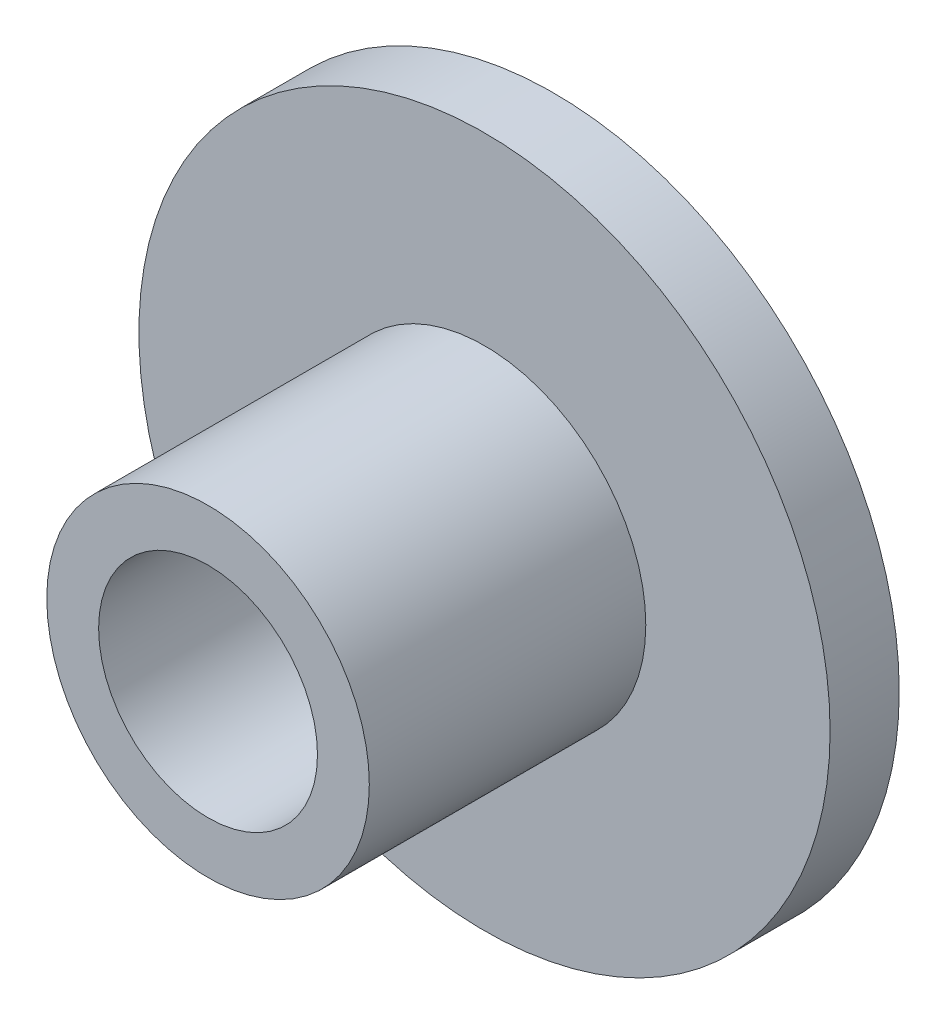
ISO-10303-21;
HEADER;
FILE_DESCRIPTION(('STEP AP214'),'2;1');
FILE_NAME('part.step','',(''),(''),'','','');
FILE_SCHEMA(('AUTOMOTIVE_DESIGN { 1 0 10303 214 1 1 1 1 }'));
ENDSEC;
DATA;
#1=APPLICATION_CONTEXT('core data for automotive mechanical design processes');
#2=APPLICATION_PROTOCOL_DEFINITION('international standard','automotive_design',2000,#1);
#3=PRODUCT_CONTEXT('',#1,'mechanical');
#4=PRODUCT('Part','Part','',(#3));
#5=PRODUCT_RELATED_PRODUCT_CATEGORY('part','',(#4));
#6=PRODUCT_DEFINITION_FORMATION('','',#4);
#7=PRODUCT_DEFINITION_CONTEXT('part definition',#1,'design');
#8=PRODUCT_DEFINITION('design','',#6,#7);
#9=PRODUCT_DEFINITION_SHAPE('','',#8);
#10=(LENGTH_UNIT() NAMED_UNIT(*) SI_UNIT(.MILLI.,.METRE.));
#11=(NAMED_UNIT(*) PLANE_ANGLE_UNIT() SI_UNIT($,.RADIAN.));
#12=(NAMED_UNIT(*) SI_UNIT($,.STERADIAN.) SOLID_ANGLE_UNIT());
#13=UNCERTAINTY_MEASURE_WITH_UNIT(LENGTH_MEASURE(1.E-05),#10,'distance_accuracy_value','');
#14=(GEOMETRIC_REPRESENTATION_CONTEXT(3) GLOBAL_UNCERTAINTY_ASSIGNED_CONTEXT((#13)) GLOBAL_UNIT_ASSIGNED_CONTEXT((#10,
#11,#12)) REPRESENTATION_CONTEXT('',''));
#15=CARTESIAN_POINT('',(0.,0.,0.));
#16=DIRECTION('',(0.,0.,1.));
#17=DIRECTION('',(1.,0.,0.));
#18=AXIS2_PLACEMENT_3D('',#15,#16,#17);
#19=CARTESIAN_POINT('',(0.,0.,15.));
#20=DIRECTION('',(0.,0.,1.));
#21=DIRECTION('',(1.,0.,0.));
#22=AXIS2_PLACEMENT_3D('',#19,#20,#21);
#23=PLANE('',#22);
#24=CARTESIAN_POINT('',(0.,0.,15.));
#25=DIRECTION('',(0.,0.,1.));
#26=DIRECTION('',(1.,0.,0.));
#27=AXIS2_PLACEMENT_3D('',#24,#25,#26);
#28=CIRCLE('',#27,4.75);
#29=CARTESIAN_POINT('',(4.75,0.,15.));
#30=VERTEX_POINT('',#29);
#31=EDGE_CURVE('E38',#30,#30,#28,.T.);
#32=ORIENTED_EDGE('',*,*,#31,.F.);
#33=EDGE_LOOP('',(#32));
#34=FACE_BOUND('',#33,.T.);
#35=CARTESIAN_POINT('',(0.,0.,15.));
#36=DIRECTION('',(0.,0.,1.));
#37=DIRECTION('',(1.,0.,0.));
#38=AXIS2_PLACEMENT_3D('',#35,#36,#37);
#39=CIRCLE('',#38,7.);
#40=CARTESIAN_POINT('',(7.,0.,15.));
#41=VERTEX_POINT('',#40);
#42=EDGE_CURVE('E52',#41,#41,#39,.T.);
#43=ORIENTED_EDGE('',*,*,#42,.T.);
#44=EDGE_LOOP('',(#43));
#45=FACE_BOUND('',#44,.T.);
#46=ADVANCED_FACE('F31',(#34,#45),#23,.T.);
#47=CARTESIAN_POINT('',(0.,0.,15.));
#48=DIRECTION('',(0.,0.,-1.));
#49=DIRECTION('',(-1.,0.,0.));
#50=AXIS2_PLACEMENT_3D('',#47,#48,#49);
#51=CYLINDRICAL_SURFACE('',#50,15.);
#52=CARTESIAN_POINT('',(0.,0.,0.));
#53=DIRECTION('',(0.,0.,1.));
#54=DIRECTION('',(1.,0.,0.));
#55=AXIS2_PLACEMENT_3D('',#52,#53,#54);
#56=CIRCLE('',#55,15.);
#57=CARTESIAN_POINT('',(15.,0.,0.));
#58=VERTEX_POINT('',#57);
#59=EDGE_CURVE('E10',#58,#58,#56,.T.);
#60=ORIENTED_EDGE('',*,*,#59,.T.);
#61=EDGE_LOOP('',(#60));
#62=FACE_BOUND('',#61,.T.);
#63=CARTESIAN_POINT('',(0.,0.,3.));
#64=DIRECTION('',(0.,0.,1.));
#65=DIRECTION('',(1.,0.,0.));
#66=AXIS2_PLACEMENT_3D('',#63,#64,#65);
#67=CIRCLE('',#66,15.);
#68=CARTESIAN_POINT('',(15.,0.,3.));
#69=VERTEX_POINT('',#68);
#70=EDGE_CURVE('E47',#69,#69,#67,.T.);
#71=ORIENTED_EDGE('',*,*,#70,.F.);
#72=EDGE_LOOP('',(#71));
#73=FACE_BOUND('',#72,.T.);
#74=ADVANCED_FACE('F33',(#62,#73),#51,.T.);
#75=CARTESIAN_POINT('',(0.,0.,0.));
#76=DIRECTION('',(0.,0.,1.));
#77=DIRECTION('',(1.,0.,0.));
#78=AXIS2_PLACEMENT_3D('',#75,#76,#77);
#79=PLANE('',#78);
#80=ORIENTED_EDGE('',*,*,#59,.F.);
#81=EDGE_LOOP('',(#80));
#82=FACE_BOUND('',#81,.T.);
#83=CARTESIAN_POINT('',(0.,0.,0.));
#84=DIRECTION('',(0.,0.,1.));
#85=DIRECTION('',(1.,0.,0.));
#86=AXIS2_PLACEMENT_3D('',#83,#84,#85);
#87=CIRCLE('',#86,4.75);
#88=CARTESIAN_POINT('',(4.75,0.,0.));
#89=VERTEX_POINT('',#88);
#90=EDGE_CURVE('E42',#89,#89,#87,.T.);
#91=ORIENTED_EDGE('',*,*,#90,.T.);
#92=EDGE_LOOP('',(#91));
#93=FACE_BOUND('',#92,.T.);
#94=ADVANCED_FACE('F69',(#82,#93),#79,.F.);
#95=CARTESIAN_POINT('',(0.,0.,15.));
#96=DIRECTION('',(0.,0.,-1.));
#97=DIRECTION('',(-1.,0.,0.));
#98=AXIS2_PLACEMENT_3D('',#95,#96,#97);
#99=CYLINDRICAL_SURFACE('',#98,4.75);
#100=ORIENTED_EDGE('',*,*,#31,.T.);
#101=EDGE_LOOP('',(#100));
#102=FACE_BOUND('',#101,.T.);
#103=ORIENTED_EDGE('',*,*,#90,.F.);
#104=EDGE_LOOP('',(#103));
#105=FACE_BOUND('',#104,.T.);
#106=ADVANCED_FACE('F64',(#102,#105),#99,.F.);
#107=CARTESIAN_POINT('',(0.,0.,3.));
#108=DIRECTION('',(0.,0.,1.));
#109=DIRECTION('',(1.,0.,0.));
#110=AXIS2_PLACEMENT_3D('',#107,#108,#109);
#111=PLANE('',#110);
#112=CARTESIAN_POINT('',(0.,0.,3.));
#113=DIRECTION('',(0.,0.,1.));
#114=DIRECTION('',(1.,0.,0.));
#115=AXIS2_PLACEMENT_3D('',#112,#113,#114);
#116=CIRCLE('',#115,7.);
#117=CARTESIAN_POINT('',(7.,0.,3.));
#118=VERTEX_POINT('',#117);
#119=EDGE_CURVE('E51',#118,#118,#116,.T.);
#120=ORIENTED_EDGE('',*,*,#119,.F.);
#121=EDGE_LOOP('',(#120));
#122=FACE_BOUND('',#121,.T.);
#123=ORIENTED_EDGE('',*,*,#70,.T.);
#124=EDGE_LOOP('',(#123));
#125=FACE_BOUND('',#124,.T.);
#126=ADVANCED_FACE('F61',(#122,#125),#111,.T.);
#127=CARTESIAN_POINT('',(0.,0.,3.));
#128=DIRECTION('',(0.,0.,1.));
#129=DIRECTION('',(1.,0.,0.));
#130=AXIS2_PLACEMENT_3D('',#127,#128,#129);
#131=CYLINDRICAL_SURFACE('',#130,7.);
#132=ORIENTED_EDGE('',*,*,#119,.T.);
#133=EDGE_LOOP('',(#132));
#134=FACE_BOUND('',#133,.T.);
#135=ORIENTED_EDGE('',*,*,#42,.F.);
#136=EDGE_LOOP('',(#135));
#137=FACE_BOUND('',#136,.T.);
#138=ADVANCED_FACE('F58',(#134,#137),#131,.T.);
#139=CLOSED_SHELL('',(#46,#74,#94,#106,#126,#138));
#140=MANIFOLD_SOLID_BREP('B2',#139);
#141=ADVANCED_BREP_SHAPE_REPRESENTATION('',(#18,#140),#14);
#142=SHAPE_DEFINITION_REPRESENTATION(#9,#141);
ENDSEC;
END-ISO-10303-21;
